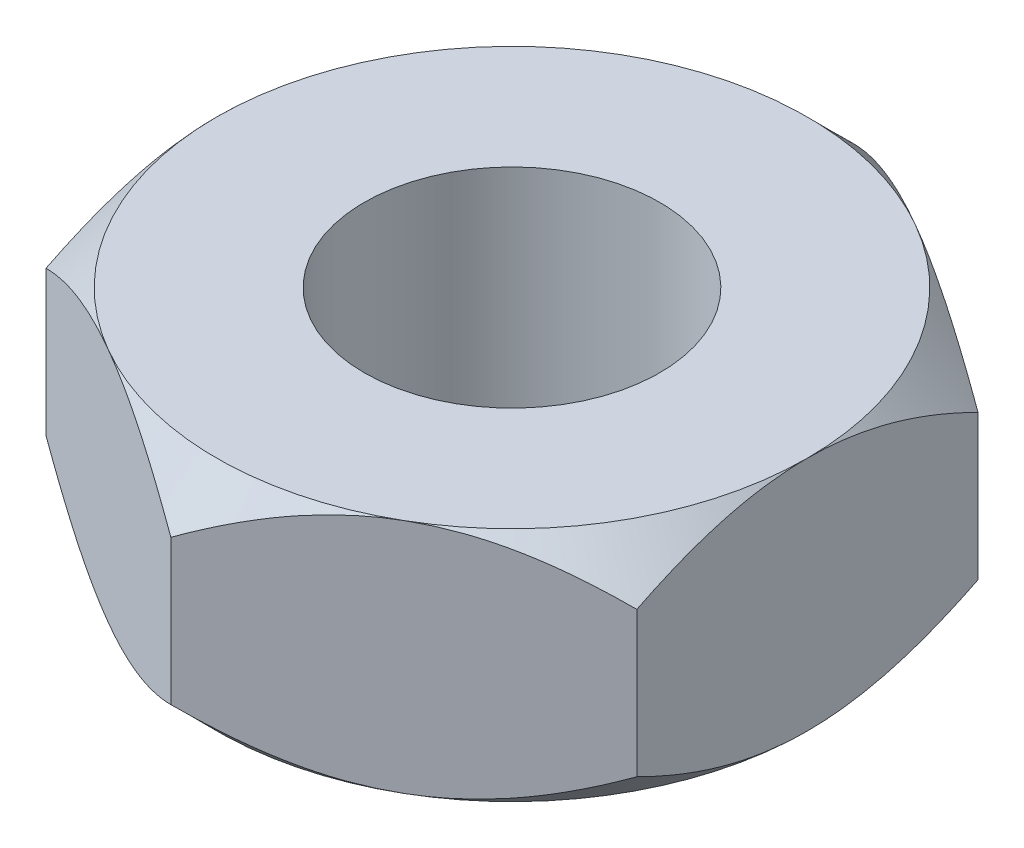
ISO-10303-21;
HEADER;
FILE_DESCRIPTION(('STEP AP214'),'2;1');
FILE_NAME('part.step','',(''),(''),'','','');
FILE_SCHEMA(('AUTOMOTIVE_DESIGN { 1 0 10303 214 1 1 1 1 }'));
ENDSEC;
DATA;
#1=APPLICATION_CONTEXT('core data for automotive mechanical design processes');
#2=APPLICATION_PROTOCOL_DEFINITION('international standard','automotive_design',2000,#1);
#3=PRODUCT_CONTEXT('',#1,'mechanical');
#4=PRODUCT('Part','Part','',(#3));
#5=PRODUCT_RELATED_PRODUCT_CATEGORY('part','',(#4));
#6=PRODUCT_DEFINITION_FORMATION('','',#4);
#7=PRODUCT_DEFINITION_CONTEXT('part definition',#1,'design');
#8=PRODUCT_DEFINITION('design','',#6,#7);
#9=PRODUCT_DEFINITION_SHAPE('','',#8);
#10=(LENGTH_UNIT() NAMED_UNIT(*) SI_UNIT(.MILLI.,.METRE.));
#11=(NAMED_UNIT(*) PLANE_ANGLE_UNIT() SI_UNIT($,.RADIAN.));
#12=(NAMED_UNIT(*) SI_UNIT($,.STERADIAN.) SOLID_ANGLE_UNIT());
#13=UNCERTAINTY_MEASURE_WITH_UNIT(LENGTH_MEASURE(1.E-05),#10,'distance_accuracy_value','');
#14=(GEOMETRIC_REPRESENTATION_CONTEXT(3) GLOBAL_UNCERTAINTY_ASSIGNED_CONTEXT((#13)) GLOBAL_UNIT_ASSIGNED_CONTEXT((#10,
#11,#12)) REPRESENTATION_CONTEXT('',''));
#15=CARTESIAN_POINT('',(0.,0.,0.));
#16=DIRECTION('',(0.,0.,1.));
#17=DIRECTION('',(1.,0.,0.));
#18=AXIS2_PLACEMENT_3D('',#15,#16,#17);
#19=CARTESIAN_POINT('',(1.99999999999999,1.6,-1.15470053837928));
#20=DIRECTION('',(-0.499999999999995,0.,0.866025403784442));
#21=DIRECTION('',(0.866025403784442,0.,0.499999999999995));
#22=AXIS2_PLACEMENT_3D('',#19,#20,#21);
#23=PLANE('',#22);
#24=CARTESIAN_POINT('',(-0.000200000000000004,0.309516555472163,-2.30951654681234));
#25=CARTESIAN_POINT('',(0.0685530340307052,0.269854166984096,-2.26982196410711));
#26=CARTESIAN_POINT('',(0.138455742135511,0.232521059042667,-2.22946361676572));
#27=CARTESIAN_POINT('',(0.280995244550435,0.164164761894649,-2.14716839667631));
#28=CARTESIAN_POINT('',(0.353645597565357,0.133179610495727,-2.10522369580642));
#29=CARTESIAN_POINT('',(0.500141601053969,0.0801012933026502,-2.02064418875707));
#30=CARTESIAN_POINT('',(0.573949935246292,0.057874703935119,-1.97803092714269));
#31=CARTESIAN_POINT('',(0.723191631835261,0.0236298934335896,-1.89186619344274));
#32=CARTESIAN_POINT('',(0.798620433918148,0.0115861059026441,-1.84831735425553));
#33=CARTESIAN_POINT('',(0.928615500671075,0.000719588664081582,-1.77326466747241));
#34=CARTESIAN_POINT('',(0.983013783970105,-0.000889169631519565,-1.74185780396626));
#35=CARTESIAN_POINT('',(1.09172145551969,0.00181995435722156,-1.67909540053413));
#36=CARTESIAN_POINT('',(1.14603080592134,0.00613991451648442,-1.64773988246023));
#37=CARTESIAN_POINT('',(1.25413672758934,0.0204606441684161,-1.58532489948421));
#38=CARTESIAN_POINT('',(1.30793265655479,0.0304677695205167,-1.5542658054147));
#39=CARTESIAN_POINT('',(1.41459426230557,0.0556135070081701,-1.49268469862229));
#40=CARTESIAN_POINT('',(1.46746001007071,0.0707517258007509,-1.46216264491918));
#41=CARTESIAN_POINT('',(1.60287973308984,0.115695580187701,-1.3839780313805));
#42=CARTESIAN_POINT('',(1.68459383484947,0.148889916184325,-1.33680037273299));
#43=CARTESIAN_POINT('',(1.8047470372578,0.204926899929877,-1.26742988897855));
#44=CARTESIAN_POINT('',(1.84434285210917,0.224615779705447,-1.24456923461533));
#45=CARTESIAN_POINT('',(1.92280095888786,0.265788395123377,-1.19927142554654));
#46=CARTESIAN_POINT('',(1.96166368359373,0.287271028409751,-1.17683402097617));
#47=CARTESIAN_POINT('',(2.00019999999999,0.309516555472163,-1.15458506832544));
#48=B_SPLINE_CURVE_WITH_KNOTS('',3,(#24,#25,#26,#27,#28,#29,#30,#31,#32,#33,#34,#35,#36,#37,#38,
#39,#40,#41,#42,#43,#44,#45,#46,#47),.UNSPECIFIED.,.F.,.F.,(4,2,2,2,2,2,2,2,2,2,2,4),(0.,
0.266420613771061,0.534393751523383,0.798110374376907,1.06116288956935,1.24939906803721,
1.43770123566247,1.62621426093931,1.81471283831913,2.11415604834143,2.26347170717788,
2.41269626969768),.UNSPECIFIED.);
#49=CARTESIAN_POINT('',(0.,0.309401076758504,-2.3094010767585));
#50=VERTEX_POINT('',#49);
#51=CARTESIAN_POINT('',(0.99999999999999,0.,-1.73205080756888));
#52=VERTEX_POINT('',#51);
#53=EDGE_CURVE('E51',#50,#52,#48,.T.);
#54=ORIENTED_EDGE('',*,*,#53,.F.);
#55=DIRECTION('',(0.,-1.,0.));
#56=VECTOR('',#55,1.);
#57=CARTESIAN_POINT('',(0.,1.6,-2.3094010767585));
#58=LINE('',#57,#56);
#59=CARTESIAN_POINT('',(0.,1.2905989232415,-2.3094010767585));
#60=VERTEX_POINT('',#59);
#61=EDGE_CURVE('E277',#60,#50,#58,.T.);
#62=ORIENTED_EDGE('',*,*,#61,.F.);
#63=CARTESIAN_POINT('',(2.00019999999999,1.29048344452784,-1.15458506832544));
#64=CARTESIAN_POINT('',(1.93144696596928,1.3301458330159,-1.19427965103067));
#65=CARTESIAN_POINT('',(1.86154425786448,1.36747894095733,-1.23463799837206));
#66=CARTESIAN_POINT('',(1.71900475544955,1.43583523810535,-1.31693321846147));
#67=CARTESIAN_POINT('',(1.64635440243463,1.46682038950427,-1.35887791933136));
#68=CARTESIAN_POINT('',(1.49985839894602,1.51989870669735,-1.44345742638071));
#69=CARTESIAN_POINT('',(1.4260500647537,1.54212529606488,-1.48607068799509));
#70=CARTESIAN_POINT('',(1.27680836816473,1.57637010656641,-1.57223542169504));
#71=CARTESIAN_POINT('',(1.20137956608184,1.58841389409736,-1.61578426088225));
#72=CARTESIAN_POINT('',(1.07138449932891,1.59928041133592,-1.69083694766537));
#73=CARTESIAN_POINT('',(1.01698621602988,1.60088916963152,-1.72224381117152));
#74=CARTESIAN_POINT('',(0.908278544480296,1.59818004564278,-1.78500621460365));
#75=CARTESIAN_POINT('',(0.853969194078651,1.59386008548352,-1.81636173267755));
#76=CARTESIAN_POINT('',(0.745863272410651,1.57953935583158,-1.87877671565357));
#77=CARTESIAN_POINT('',(0.692067343445196,1.56953223047948,-1.90983580972308));
#78=CARTESIAN_POINT('',(0.585405737694414,1.54438649299183,-1.97141691651549));
#79=CARTESIAN_POINT('',(0.532539989929275,1.52924827419925,-2.0019389702186));
#80=CARTESIAN_POINT('',(0.397120266910145,1.4843044198123,-2.08012358375728));
#81=CARTESIAN_POINT('',(0.315406165150513,1.45111008381567,-2.12730124240479));
#82=CARTESIAN_POINT('',(0.195252962742193,1.39507310007012,-2.19667172615923));
#83=CARTESIAN_POINT('',(0.155657147890819,1.37538422029455,-2.21953238052245));
#84=CARTESIAN_POINT('',(0.0771990411121257,1.33421160487662,-2.26483018959124));
#85=CARTESIAN_POINT('',(0.0383363164062586,1.31272897159025,-2.28726759416161));
#86=CARTESIAN_POINT('',(-0.000199999999999872,1.29048344452784,-2.30951654681234));
#87=B_SPLINE_CURVE_WITH_KNOTS('',3,(#63,#64,#65,#66,#67,#68,#69,#70,#71,#72,#73,#74,#75,#76,#77,
#78,#79,#80,#81,#82,#83,#84,#85,#86),.UNSPECIFIED.,.F.,.F.,(4,2,2,2,2,2,2,2,2,2,2,4),(0.,
0.266420613771061,0.534393751523383,0.798110374376907,1.06116288956935,1.24939906803721,
1.43770123566247,1.62621426093931,1.81471283831913,2.11415604834143,2.26347170717788,
2.41269626969768),.UNSPECIFIED.);
#88=CARTESIAN_POINT('',(0.999999999999994,1.6,-1.73205080756889));
#89=VERTEX_POINT('',#88);
#90=EDGE_CURVE('E249',#89,#60,#87,.T.);
#91=ORIENTED_EDGE('',*,*,#90,.F.);
#92=CARTESIAN_POINT('',(1.99999999999999,1.2905989232415,-1.15470053837928));
#93=VERTEX_POINT('',#92);
#94=EDGE_CURVE('E317',#93,#89,#87,.T.);
#95=ORIENTED_EDGE('',*,*,#94,.F.);
#96=DIRECTION('',(0.,-1.,0.));
#97=VECTOR('',#96,1.);
#98=CARTESIAN_POINT('',(1.99999999999999,1.6,-1.15470053837928));
#99=LINE('',#98,#97);
#100=CARTESIAN_POINT('',(1.99999999999999,0.309401076758504,-1.15470053837928));
#101=VERTEX_POINT('',#100);
#102=EDGE_CURVE('E319',#93,#101,#99,.T.);
#103=ORIENTED_EDGE('',*,*,#102,.T.);
#104=EDGE_CURVE('E136',#52,#101,#48,.T.);
#105=ORIENTED_EDGE('',*,*,#104,.F.);
#106=EDGE_LOOP('',(#54,#62,#91,#95,#103,#105));
#107=FACE_BOUND('',#106,.T.);
#108=ADVANCED_FACE('F35',(#107),#23,.F.);
#109=CARTESIAN_POINT('',(0.,1.6,-2.3094010767585));
#110=DIRECTION('',(0.500000000000001,0.,0.866025403784438));
#111=DIRECTION('',(0.866025403784438,0.,-0.500000000000001));
#112=AXIS2_PLACEMENT_3D('',#109,#110,#111);
#113=PLANE('',#112);
#114=CARTESIAN_POINT('',(-2.0002,0.309516555472163,-1.15458506832541));
#115=CARTESIAN_POINT('',(-1.9314469659693,0.269854166984095,-1.19427965103064));
#116=CARTESIAN_POINT('',(-1.86154425786449,0.232521059042665,-1.23463799837204));
#117=CARTESIAN_POINT('',(-1.71900475544957,0.164164761894646,-1.31693321846145));
#118=CARTESIAN_POINT('',(-1.64635440243465,0.133179610495723,-1.35887791933133));
#119=CARTESIAN_POINT('',(-1.49985839894603,0.0801012933026451,-1.44345742638069));
#120=CARTESIAN_POINT('',(-1.42605006475371,0.0578747039351132,-1.48607068799507));
#121=CARTESIAN_POINT('',(-1.27680836816474,0.0236298934335826,-1.57223542169502));
#122=CARTESIAN_POINT('',(-1.20137956608185,0.0115861059026366,-1.61578426088223));
#123=CARTESIAN_POINT('',(-1.07138449932892,0.000719588664073623,-1.69083694766536));
#124=CARTESIAN_POINT('',(-1.01698621602989,-0.000889169631527687,-1.72224381117151));
#125=CARTESIAN_POINT('',(-0.908278544480308,0.00181995435721309,-1.78500621460364));
#126=CARTESIAN_POINT('',(-0.853969194078663,0.00613991451647577,-1.81636173267754));
#127=CARTESIAN_POINT('',(-0.745863272410664,0.0204606441684074,-1.87877671565355));
#128=CARTESIAN_POINT('',(-0.69206734344521,0.0304677695205081,-1.90983580972306));
#129=CARTESIAN_POINT('',(-0.585405737694428,0.0556135070081612,-1.97141691651547));
#130=CARTESIAN_POINT('',(-0.532539989929289,0.0707517258007417,-2.00193897021859));
#131=CARTESIAN_POINT('',(-0.397120266910157,0.115695580187692,-2.08012358375727));
#132=CARTESIAN_POINT('',(-0.315406165150522,0.148889916184318,-2.12730124240478));
#133=CARTESIAN_POINT('',(-0.195252962742198,0.204926899929873,-2.19667172615922));
#134=CARTESIAN_POINT('',(-0.155657147890823,0.224615779705443,-2.21953238052245));
#135=CARTESIAN_POINT('',(-0.0771990411121277,0.265788395123375,-2.26483018959124));
#136=CARTESIAN_POINT('',(-0.0383363164062596,0.28727102840975,-2.28726759416161));
#137=CARTESIAN_POINT('',(0.000200000000000142,0.309516555472163,-2.30951654681234));
#138=B_SPLINE_CURVE_WITH_KNOTS('',3,(#114,#115,#116,#117,#118,#119,#120,#121,#122,#123,#124,
#125,#126,#127,#128,#129,#130,#131,#132,#133,#134,#135,#136,#137),.UNSPECIFIED.,.F.,.F.,(4,2,2,
2,2,2,2,2,2,2,2,4),(0.,0.266420613771064,0.53439375152339,0.798110374376917,1.06116288956937,
1.24939906803722,1.43770123566248,1.62621426093932,1.81471283831914,2.11415604834145,
2.26347170717791,2.41269626969771),.UNSPECIFIED.);
#139=CARTESIAN_POINT('',(-2.,0.309401076758504,-1.15470053837925));
#140=VERTEX_POINT('',#139);
#141=CARTESIAN_POINT('',(-1.,0.,-1.73205080756888));
#142=VERTEX_POINT('',#141);
#143=EDGE_CURVE('E59',#140,#142,#138,.T.);
#144=ORIENTED_EDGE('',*,*,#143,.F.);
#145=DIRECTION('',(0.,-1.,0.));
#146=VECTOR('',#145,1.);
#147=CARTESIAN_POINT('',(-2.,1.6,-1.15470053837925));
#148=LINE('',#147,#146);
#149=CARTESIAN_POINT('',(-2.,1.2905989232415,-1.15470053837925));
#150=VERTEX_POINT('',#149);
#151=EDGE_CURVE('E270',#150,#140,#148,.T.);
#152=ORIENTED_EDGE('',*,*,#151,.F.);
#153=CARTESIAN_POINT('',(0.000200000000000008,1.29048344452784,-2.30951654681234));
#154=CARTESIAN_POINT('',(-0.0685530340307058,1.3301458330159,-2.26982196410711));
#155=CARTESIAN_POINT('',(-0.138455742135512,1.36747894095734,-2.22946361676572));
#156=CARTESIAN_POINT('',(-0.280995244550437,1.43583523810535,-2.1471683966763));
#157=CARTESIAN_POINT('',(-0.353645597565359,1.46682038950428,-2.10522369580642));
#158=CARTESIAN_POINT('',(-0.500141601053973,1.51989870669736,-2.02064418875706));
#159=CARTESIAN_POINT('',(-0.573949935246296,1.54212529606489,-1.97803092714269));
#160=CARTESIAN_POINT('',(-0.723191631835266,1.57637010656642,-1.89186619344273));
#161=CARTESIAN_POINT('',(-0.798620433918154,1.58841389409736,-1.84831735425552));
#162=CARTESIAN_POINT('',(-0.928615500671082,1.59928041133593,-1.7732646674724));
#163=CARTESIAN_POINT('',(-0.983013783970112,1.60088916963153,-1.74185780396625));
#164=CARTESIAN_POINT('',(-1.0917214555197,1.59818004564279,-1.67909540053412));
#165=CARTESIAN_POINT('',(-1.14603080592134,1.59386008548352,-1.64773988246021));
#166=CARTESIAN_POINT('',(-1.25413672758934,1.57953935583159,-1.5853248994842));
#167=CARTESIAN_POINT('',(-1.30793265655479,1.56953223047949,-1.55426580541469));
#168=CARTESIAN_POINT('',(-1.41459426230558,1.54438649299184,-1.49268469862228));
#169=CARTESIAN_POINT('',(-1.46746001007072,1.52924827419926,-1.46216264491916));
#170=CARTESIAN_POINT('',(-1.60287973308985,1.48430441981231,-1.38397803138048));
#171=CARTESIAN_POINT('',(-1.68459383484948,1.45111008381568,-1.33680037273297));
#172=CARTESIAN_POINT('',(-1.80474703725781,1.39507310007013,-1.26742988897853));
#173=CARTESIAN_POINT('',(-1.84434285210918,1.37538422029456,-1.2445692346153));
#174=CARTESIAN_POINT('',(-1.92280095888788,1.33421160487663,-1.19927142554652));
#175=CARTESIAN_POINT('',(-1.96166368359375,1.31272897159025,-1.17683402097614));
#176=CARTESIAN_POINT('',(-2.0002,1.29048344452784,-1.15458506832541));
#177=B_SPLINE_CURVE_WITH_KNOTS('',3,(#153,#154,#155,#156,#157,#158,#159,#160,#161,#162,#163,
#164,#165,#166,#167,#168,#169,#170,#171,#172,#173,#174,#175,#176),.UNSPECIFIED.,.F.,.F.,(4,2,2,
2,2,2,2,2,2,2,2,4),(0.,0.266420613771064,0.534393751523391,0.798110374376917,1.06116288956937,
1.24939906803722,1.43770123566248,1.62621426093932,1.81471283831914,2.11415604834145,
2.26347170717791,2.41269626969771),.UNSPECIFIED.);
#178=CARTESIAN_POINT('',(-1.,1.6,-1.73205080756888));
#179=VERTEX_POINT('',#178);
#180=EDGE_CURVE('E242',#179,#150,#177,.T.);
#181=ORIENTED_EDGE('',*,*,#180,.F.);
#182=EDGE_CURVE('E248',#60,#179,#177,.T.);
#183=ORIENTED_EDGE('',*,*,#182,.F.);
#184=ORIENTED_EDGE('',*,*,#61,.T.);
#185=EDGE_CURVE('E159',#142,#50,#138,.T.);
#186=ORIENTED_EDGE('',*,*,#185,.F.);
#187=EDGE_LOOP('',(#144,#152,#181,#183,#184,#186));
#188=FACE_BOUND('',#187,.T.);
#189=ADVANCED_FACE('F255',(#188),#113,.F.);
#190=CARTESIAN_POINT('',(-2.,1.6,-1.15470053837925));
#191=DIRECTION('',(1.,0.,0.));
#192=DIRECTION('',(0.,0.,-1.));
#193=AXIS2_PLACEMENT_3D('',#190,#191,#192);
#194=PLANE('',#193);
#195=CARTESIAN_POINT('',(-2.00000000000001,1.29019488252983,-2.61254327524453));
#196=CARTESIAN_POINT('',(-2.00000000000001,1.24064534414815,-2.55012778852981));
#197=CARTESIAN_POINT('',(-2.00000000000001,1.19148330047981,-2.48740009058871));
#198=CARTESIAN_POINT('',(-2.00000000000001,1.0941173988925,-2.36118487448526));
#199=CARTESIAN_POINT('',(-2.00000000000001,1.04591374676681,-2.29769719772447));
#200=CARTESIAN_POINT('',(-2.00000000000001,0.950307536984489,-2.16936780427217));
#201=CARTESIAN_POINT('',(-2.00000000000001,0.902913838258009,-2.10451946738864));
#202=CARTESIAN_POINT('',(-2.00000000000001,0.809580787991221,-1.97378837476002));
#203=CARTESIAN_POINT('',(-2.00000000000001,0.763641339653711,-1.90790568830138));
#204=CARTESIAN_POINT('',(-2.00000000000001,0.670147526687691,-1.76987564613341));
#205=CARTESIAN_POINT('',(-2.00000000000001,0.622734688153935,-1.69763195640554));
#206=CARTESIAN_POINT('',(-2.00000000000001,0.530577577337536,-1.55146442665623));
#207=CARTESIAN_POINT('',(-2.00000000000001,0.485832968027409,-1.47754080046576));
#208=CARTESIAN_POINT('',(-2.,0.399917834631021,-1.32791120028739));
#209=CARTESIAN_POINT('',(-2.,0.358737439259264,-1.25221093871324));
#210=CARTESIAN_POINT('',(-2.,0.280881091671754,-1.09854641049698));
#211=CARTESIAN_POINT('',(-2.,0.244202870567784,-1.02058330891973));
#212=CARTESIAN_POINT('',(-2.,0.181029803464532,-0.87223711935323));
#213=CARTESIAN_POINT('',(-2.,0.153832752001086,-0.802156090362227));
#214=CARTESIAN_POINT('',(-2.,0.105040182157819,-0.660033594508962));
#215=CARTESIAN_POINT('',(-2.,0.0834449845291973,-0.587992015650283));
#216=CARTESIAN_POINT('',(-2.,0.0474732392278032,-0.443748253089858));
#217=CARTESIAN_POINT('',(-2.,0.0329510233949112,-0.371583056922965));
#218=CARTESIAN_POINT('',(-2.,0.0114600647392787,-0.226130131551975));
#219=CARTESIAN_POINT('',(-2.,0.00448913863026258,-0.152842733025714));
#220=CARTESIAN_POINT('',(-2.,-0.00116339348483317,-0.0103634777354571));
#221=CARTESIAN_POINT('',(-2.,-0.000318383061124951,0.0588095691835743));
#222=CARTESIAN_POINT('',(-2.,0.00847068441443788,0.196699474123196));
#223=CARTESIAN_POINT('',(-2.,0.0164152870195975,0.265416296677364));
#224=CARTESIAN_POINT('',(-2.,0.0390597197043327,0.403074136856636));
#225=CARTESIAN_POINT('',(-2.,0.0538872817581779,0.471993766190368));
#226=CARTESIAN_POINT('',(-2.,0.0894169378625835,0.608270025322452));
#227=CARTESIAN_POINT('',(-2.,0.110119020964438,0.675626658033603));
#228=CARTESIAN_POINT('',(-2.,0.17976569086058,0.875863394424112));
#229=CARTESIAN_POINT('',(-2.,0.236106709815166,1.00615820059957));
#230=CARTESIAN_POINT('',(-2.,0.361570324526107,1.26069744733846));
#231=CARTESIAN_POINT('',(-2.,0.430736681980139,1.38491927485267));
#232=CARTESIAN_POINT('',(-1.99999999999999,0.538807465716636,1.56449502677459));
#233=CARTESIAN_POINT('',(-1.99999999999999,0.574551900249282,1.62178989348194));
#234=CARTESIAN_POINT('',(-1.99999999999999,0.647583221318526,1.73539571794536));
#235=CARTESIAN_POINT('',(-1.99999999999999,0.684870221444954,1.79170660280819));
#236=CARTESIAN_POINT('',(-1.99999999999999,0.760406855331997,1.9030251252792));
#237=CARTESIAN_POINT('',(-1.99999999999999,0.798646539051194,1.95803954900724));
#238=CARTESIAN_POINT('',(-1.99999999999999,0.87616202513888,2.06731164689541));
#239=CARTESIAN_POINT('',(-1.99999999999999,0.915437539395688,2.12156952519856));
#240=CARTESIAN_POINT('',(-1.99999999999999,0.955138269586996,2.17550963968852));
#241=B_SPLINE_CURVE_WITH_KNOTS('',3,(#195,#196,#197,#198,#199,#200,#201,#202,#203,#204,#205,
#206,#207,#208,#209,#210,#211,#212,#213,#214,#215,#216,#217,#218,#219,#220,#221,#222,#223,#224,
#225,#226,#227,#228,#229,#230,#231,#232,#233,#234,#235,#236,#237,#238,#239,#240),.UNSPECIFIED.,
.F.,.F.,(4,2,2,2,2,2,2,2,2,2,2,2,2,2,2,2,2,2,2,2,2,2,4),(0.,0.239080449310993,0.478211693165812,
0.719158208726349,0.960088652639677,1.21928095842057,1.47844045563563,1.73685755422555,
1.9951438831296,2.22047513680923,2.44581928966948,2.66630243337519,2.88672181228999,
3.09388290836222,3.30105992466437,3.51224559004557,3.72343086182966,4.14807332597343,
4.57419231623005,4.77676462727743,4.97935188177691,5.18033632757739,5.38126544805775),.UNSPECIFIED.);
#242=CARTESIAN_POINT('',(-2.,0.309401076758504,1.15470053837926));
#243=VERTEX_POINT('',#242);
#244=CARTESIAN_POINT('',(-2.,0.,0.));
#245=VERTEX_POINT('',#244);
#246=EDGE_CURVE('E346',#243,#245,#241,.F.);
#247=ORIENTED_EDGE('',*,*,#246,.F.);
#248=DIRECTION('',(0.,-1.,0.));
#249=VECTOR('',#248,1.);
#250=CARTESIAN_POINT('',(-2.,1.6,1.15470053837926));
#251=LINE('',#250,#249);
#252=CARTESIAN_POINT('',(-2.,1.2905989232415,1.15470053837926));
#253=VERTEX_POINT('',#252);
#254=EDGE_CURVE('E278',#253,#243,#251,.T.);
#255=ORIENTED_EDGE('',*,*,#254,.F.);
#256=CARTESIAN_POINT('',(-2.00000000000001,0.309805117470175,-2.61254327524453));
#257=CARTESIAN_POINT('',(-2.00000000000001,0.359354655851849,-2.55012778852981));
#258=CARTESIAN_POINT('',(-2.00000000000001,0.40851669952019,-2.48740009058871));
#259=CARTESIAN_POINT('',(-2.00000000000001,0.5058826011075,-2.36118487448526));
#260=CARTESIAN_POINT('',(-2.00000000000001,0.554086253233187,-2.29769719772447));
#261=CARTESIAN_POINT('',(-2.00000000000001,0.649692463015511,-2.16936780427217));
#262=CARTESIAN_POINT('',(-2.00000000000001,0.697086161741992,-2.10451946738864));
#263=CARTESIAN_POINT('',(-2.00000000000001,0.79041921200878,-1.97378837476002));
#264=CARTESIAN_POINT('',(-2.00000000000001,0.836358660346289,-1.90790568830138));
#265=CARTESIAN_POINT('',(-2.00000000000001,0.929852473312309,-1.76987564613341));
#266=CARTESIAN_POINT('',(-2.00000000000001,0.977265311846065,-1.69763195640554));
#267=CARTESIAN_POINT('',(-2.00000000000001,1.06942242266246,-1.55146442665623));
#268=CARTESIAN_POINT('',(-2.00000000000001,1.11416703197259,-1.47754080046576));
#269=CARTESIAN_POINT('',(-2.,1.20008216536898,-1.32791120028739));
#270=CARTESIAN_POINT('',(-2.,1.24126256074074,-1.25221093871324));
#271=CARTESIAN_POINT('',(-2.,1.31911890832825,-1.09854641049698));
#272=CARTESIAN_POINT('',(-2.,1.35579712943222,-1.02058330891973));
#273=CARTESIAN_POINT('',(-2.,1.41897019653547,-0.87223711935323));
#274=CARTESIAN_POINT('',(-2.,1.44616724799891,-0.802156090362227));
#275=CARTESIAN_POINT('',(-2.,1.49495981784218,-0.660033594508963));
#276=CARTESIAN_POINT('',(-2.,1.5165550154708,-0.587992015650283));
#277=CARTESIAN_POINT('',(-2.,1.5525267607722,-0.443748253089858));
#278=CARTESIAN_POINT('',(-2.,1.56704897660509,-0.371583056922966));
#279=CARTESIAN_POINT('',(-2.,1.58853993526072,-0.226130131551975));
#280=CARTESIAN_POINT('',(-2.,1.59551086136974,-0.152842733025714));
#281=CARTESIAN_POINT('',(-2.,1.60116339348483,-0.0103634777354565));
#282=CARTESIAN_POINT('',(-2.,1.60031838306112,0.0588095691835751));
#283=CARTESIAN_POINT('',(-2.,1.59152931558556,0.196699474123197));
#284=CARTESIAN_POINT('',(-2.,1.5835847129804,0.265416296677365));
#285=CARTESIAN_POINT('',(-2.,1.56094028029567,0.403074136856637));
#286=CARTESIAN_POINT('',(-2.,1.54611271824182,0.471993766190368));
#287=CARTESIAN_POINT('',(-2.,1.51058306213742,0.608270025322452));
#288=CARTESIAN_POINT('',(-2.,1.48988097903556,0.675626658033603));
#289=CARTESIAN_POINT('',(-2.,1.42023430913942,0.875863394424112));
#290=CARTESIAN_POINT('',(-2.,1.36389329018483,1.00615820059957));
#291=CARTESIAN_POINT('',(-2.,1.23842967547389,1.26069744733846));
#292=CARTESIAN_POINT('',(-2.,1.16926331801986,1.38491927485267));
#293=CARTESIAN_POINT('',(-1.99999999999999,1.06119253428336,1.56449502677459));
#294=CARTESIAN_POINT('',(-1.99999999999999,1.02544809975072,1.62178989348194));
#295=CARTESIAN_POINT('',(-1.99999999999999,0.952416778681474,1.73539571794536));
#296=CARTESIAN_POINT('',(-1.99999999999999,0.915129778555046,1.79170660280819));
#297=CARTESIAN_POINT('',(-1.99999999999999,0.839593144668003,1.9030251252792));
#298=CARTESIAN_POINT('',(-1.99999999999999,0.801353460948806,1.95803954900724));
#299=CARTESIAN_POINT('',(-1.99999999999999,0.72383797486112,2.06731164689541));
#300=CARTESIAN_POINT('',(-1.99999999999999,0.684562460604312,2.12156952519857));
#301=CARTESIAN_POINT('',(-1.99999999999999,0.644861730413004,2.17550963968852));
#302=B_SPLINE_CURVE_WITH_KNOTS('',3,(#256,#257,#258,#259,#260,#261,#262,#263,#264,#265,#266,
#267,#268,#269,#270,#271,#272,#273,#274,#275,#276,#277,#278,#279,#280,#281,#282,#283,#284,#285,
#286,#287,#288,#289,#290,#291,#292,#293,#294,#295,#296,#297,#298,#299,#300,#301),.UNSPECIFIED.,
.F.,.F.,(4,2,2,2,2,2,2,2,2,2,2,2,2,2,2,2,2,2,2,2,2,2,4),(0.,0.239080449310993,0.478211693165812,
0.71915820872635,0.960088652639677,1.21928095842057,1.47844045563563,1.73685755422555,
1.9951438831296,2.22047513680923,2.44581928966948,2.66630243337518,2.88672181228999,
3.09388290836222,3.30105992466437,3.51224559004557,3.72343086182966,4.14807332597343,
4.57419231623005,4.77676462727743,4.97935188177691,5.18033632757739,5.38126544805775),.UNSPECIFIED.);
#303=CARTESIAN_POINT('',(-2.,1.6,0.));
#304=VERTEX_POINT('',#303);
#305=EDGE_CURVE('E235',#304,#253,#302,.T.);
#306=ORIENTED_EDGE('',*,*,#305,.F.);
#307=EDGE_CURVE('E241',#150,#304,#302,.T.);
#308=ORIENTED_EDGE('',*,*,#307,.F.);
#309=ORIENTED_EDGE('',*,*,#151,.T.);
#310=EDGE_CURVE('E194',#245,#140,#241,.F.);
#311=ORIENTED_EDGE('',*,*,#310,.F.);
#312=EDGE_LOOP('',(#247,#255,#306,#308,#309,#311));
#313=FACE_BOUND('',#312,.T.);
#314=ADVANCED_FACE('F216',(#313),#194,.F.);
#315=CARTESIAN_POINT('',(-2.,1.6,1.15470053837926));
#316=DIRECTION('',(0.499999999999995,0.,-0.866025403784442));
#317=DIRECTION('',(-0.866025403784442,0.,-0.499999999999995));
#318=AXIS2_PLACEMENT_3D('',#315,#316,#317);
#319=PLANE('',#318);
#320=CARTESIAN_POINT('',(0.000200000000016131,0.309516555472163,2.30951654681234));
#321=CARTESIAN_POINT('',(-0.0685530340306898,0.269854166984095,2.26982196410711));
#322=CARTESIAN_POINT('',(-0.138455742135496,0.232521059042665,2.22946361676572));
#323=CARTESIAN_POINT('',(-0.280995244550422,0.164164761894646,2.14716839667631));
#324=CARTESIAN_POINT('',(-0.353645597565344,0.133179610495723,2.10522369580642));
#325=CARTESIAN_POINT('',(-0.500141601053958,0.0801012933026448,2.02064418875707));
#326=CARTESIAN_POINT('',(-0.573949935246282,0.0578747039351128,1.97803092714269));
#327=CARTESIAN_POINT('',(-0.723191631835253,0.0236298934335822,1.89186619344273));
#328=CARTESIAN_POINT('',(-0.798620433918141,0.0115861059026363,1.84831735425553));
#329=CARTESIAN_POINT('',(-0.928615500671069,0.00071958866407349,1.7732646674724));
#330=CARTESIAN_POINT('',(-0.983013783970099,-0.000889169631527772,1.74185780396625));
#331=CARTESIAN_POINT('',(-1.09172145551968,0.00181995435721307,1.67909540053412));
#332=CARTESIAN_POINT('',(-1.14603080592133,0.00613991451647579,1.64773988246022));
#333=CARTESIAN_POINT('',(-1.25413672758933,0.0204606441684073,1.58532489948421));
#334=CARTESIAN_POINT('',(-1.30793265655478,0.030467769520508,1.5542658054147));
#335=CARTESIAN_POINT('',(-1.41459426230556,0.0556135070081611,1.49268469862229));
#336=CARTESIAN_POINT('',(-1.4674600100707,0.0707517258007416,1.46216264491917));
#337=CARTESIAN_POINT('',(-1.60287973308984,0.115695580187693,1.3839780313805));
#338=CARTESIAN_POINT('',(-1.68459383484947,0.148889916184318,1.33680037273298));
#339=CARTESIAN_POINT('',(-1.8047470372578,0.204926899929872,1.26742988897854));
#340=CARTESIAN_POINT('',(-1.84434285210917,0.224615779705442,1.24456923461532));
#341=CARTESIAN_POINT('',(-1.92280095888787,0.265788395123374,1.19927142554653));
#342=CARTESIAN_POINT('',(-1.96166368359374,0.28727102840975,1.17683402097615));
#343=CARTESIAN_POINT('',(-2.0002,0.309516555472163,1.15458506832542));
#344=B_SPLINE_CURVE_WITH_KNOTS('',3,(#320,#321,#322,#323,#324,#325,#326,#327,#328,#329,#330,
#331,#332,#333,#334,#335,#336,#337,#338,#339,#340,#341,#342,#343),.UNSPECIFIED.,.F.,.F.,(4,2,2,
2,2,2,2,2,2,2,2,4),(0.,0.266420613771064,0.53439375152339,0.798110374376917,1.06116288956937,
1.24939906803722,1.43770123566248,1.62621426093932,1.81471283831914,2.11415604834145,
2.26347170717791,2.41269626969771),.UNSPECIFIED.);
#345=CARTESIAN_POINT('',(0.,0.309401076758504,2.3094010767585));
#346=VERTEX_POINT('',#345);
#347=CARTESIAN_POINT('',(-0.99999999999999,0.,1.73205080756888));
#348=VERTEX_POINT('',#347);
#349=EDGE_CURVE('E145',#346,#348,#344,.T.);
#350=ORIENTED_EDGE('',*,*,#349,.F.);
#351=DIRECTION('',(0.,-1.,0.));
#352=VECTOR('',#351,1.);
#353=CARTESIAN_POINT('',(0.,1.6,2.3094010767585));
#354=LINE('',#353,#352);
#355=CARTESIAN_POINT('',(0.,1.2905989232415,2.3094010767585));
#356=VERTEX_POINT('',#355);
#357=EDGE_CURVE('E158',#356,#346,#354,.T.);
#358=ORIENTED_EDGE('',*,*,#357,.F.);
#359=CARTESIAN_POINT('',(-2.0002,1.29048344452784,1.15458506832542));
#360=CARTESIAN_POINT('',(-1.93144696596929,1.33014583301591,1.19427965103065));
#361=CARTESIAN_POINT('',(-1.86154425786448,1.36747894095734,1.23463799837205));
#362=CARTESIAN_POINT('',(-1.71900475544956,1.43583523810535,1.31693321846146));
#363=CARTESIAN_POINT('',(-1.64635440243464,1.46682038950428,1.35887791933135));
#364=CARTESIAN_POINT('',(-1.49985839894602,1.51989870669736,1.4434574263807));
#365=CARTESIAN_POINT('',(-1.4260500647537,1.54212529606489,1.48607068799508));
#366=CARTESIAN_POINT('',(-1.27680836816473,1.57637010656642,1.57223542169503));
#367=CARTESIAN_POINT('',(-1.20137956608184,1.58841389409736,1.61578426088224));
#368=CARTESIAN_POINT('',(-1.07138449932891,1.59928041133593,1.69083694766536));
#369=CARTESIAN_POINT('',(-1.01698621602988,1.60088916963153,1.72224381117151));
#370=CARTESIAN_POINT('',(-0.908278544480297,1.59818004564279,1.78500621460364));
#371=CARTESIAN_POINT('',(-0.853969194078652,1.59386008548352,1.81636173267754));
#372=CARTESIAN_POINT('',(-0.745863272410653,1.57953935583159,1.87877671565356));
#373=CARTESIAN_POINT('',(-0.692067343445198,1.56953223047949,1.90983580972307));
#374=CARTESIAN_POINT('',(-0.585405737694417,1.54438649299184,1.97141691651548));
#375=CARTESIAN_POINT('',(-0.532539989929277,1.52924827419926,2.00193897021859));
#376=CARTESIAN_POINT('',(-0.397120266910144,1.48430441981231,2.08012358375727));
#377=CARTESIAN_POINT('',(-0.315406165150509,1.45111008381568,2.12730124240478));
#378=CARTESIAN_POINT('',(-0.195252962742184,1.39507310007013,2.19667172615923));
#379=CARTESIAN_POINT('',(-0.155657147890808,1.37538422029456,2.21953238052245));
#380=CARTESIAN_POINT('',(-0.0771990411121122,1.33421160487663,2.26483018959124));
#381=CARTESIAN_POINT('',(-0.0383363164062437,1.31272897159025,2.28726759416161));
#382=CARTESIAN_POINT('',(0.000200000000016104,1.29048344452784,2.30951654681234));
#383=B_SPLINE_CURVE_WITH_KNOTS('',3,(#359,#360,#361,#362,#363,#364,#365,#366,#367,#368,#369,
#370,#371,#372,#373,#374,#375,#376,#377,#378,#379,#380,#381,#382),.UNSPECIFIED.,.F.,.F.,(4,2,2,
2,2,2,2,2,2,2,2,4),(0.,0.266420613771064,0.53439375152339,0.798110374376916,1.06116288956937,
1.24939906803722,1.43770123566248,1.62621426093932,1.81471283831913,2.11415604834145,
2.26347170717791,2.41269626969771),.UNSPECIFIED.);
#384=CARTESIAN_POINT('',(-0.99999999999999,1.6,1.73205080756888));
#385=VERTEX_POINT('',#384);
#386=EDGE_CURVE('E221',#385,#356,#383,.T.);
#387=ORIENTED_EDGE('',*,*,#386,.F.);
#388=EDGE_CURVE('E228',#253,#385,#383,.T.);
#389=ORIENTED_EDGE('',*,*,#388,.F.);
#390=ORIENTED_EDGE('',*,*,#254,.T.);
#391=EDGE_CURVE('E161',#348,#243,#344,.T.);
#392=ORIENTED_EDGE('',*,*,#391,.F.);
#393=EDGE_LOOP('',(#350,#358,#387,#389,#390,#392));
#394=FACE_BOUND('',#393,.T.);
#395=ADVANCED_FACE('F213',(#394),#319,.F.);
#396=CARTESIAN_POINT('',(0.,1.6,2.3094010767585));
#397=DIRECTION('',(-0.500000000000007,0.,-0.866025403784435));
#398=DIRECTION('',(-0.866025403784435,0.,0.500000000000007));
#399=AXIS2_PLACEMENT_3D('',#396,#397,#398);
#400=PLANE('',#399);
#401=CARTESIAN_POINT('',(2.00020000000001,0.309516555472163,1.1545850683254));
#402=CARTESIAN_POINT('',(1.93144696596931,0.269854166984095,1.19427965103063));
#403=CARTESIAN_POINT('',(1.8615442578645,0.232521059042665,1.23463799837202));
#404=CARTESIAN_POINT('',(1.71900475544958,0.164164761894645,1.31693321846144));
#405=CARTESIAN_POINT('',(1.64635440243465,0.133179610495723,1.35887791933132));
#406=CARTESIAN_POINT('',(1.49985839894604,0.0801012933026446,1.44345742638068));
#407=CARTESIAN_POINT('',(1.42605006475372,0.0578747039351128,1.48607068799506));
#408=CARTESIAN_POINT('',(1.27680836816475,0.0236298934335822,1.57223542169502));
#409=CARTESIAN_POINT('',(1.20137956608186,0.0115861059026362,1.61578426088222));
#410=CARTESIAN_POINT('',(1.07138449932893,0.000719588664073491,1.69083694766535));
#411=CARTESIAN_POINT('',(1.0169862160299,-0.000889169631527705,1.7222438111715));
#412=CARTESIAN_POINT('',(0.90827854448032,0.00181995435721332,1.78500621460363));
#413=CARTESIAN_POINT('',(0.853969194078675,0.00613991451647613,1.81636173267753));
#414=CARTESIAN_POINT('',(0.745863272410677,0.0204606441684078,1.87877671565355));
#415=CARTESIAN_POINT('',(0.692067343445223,0.0304677695205085,1.90983580972306));
#416=CARTESIAN_POINT('',(0.585405737694442,0.0556135070081616,1.97141691651547));
#417=CARTESIAN_POINT('',(0.532539989929303,0.0707517258007421,2.00193897021858));
#418=CARTESIAN_POINT('',(0.397120266910171,0.115695580187693,2.08012358375727));
#419=CARTESIAN_POINT('',(0.315406165150537,0.148889916184319,2.12730124240478));
#420=CARTESIAN_POINT('',(0.195252962742213,0.204926899929873,2.19667172615922));
#421=CARTESIAN_POINT('',(0.155657147890839,0.224615779705443,2.21953238052245));
#422=CARTESIAN_POINT('',(0.0771990411121436,0.265788395123375,2.26483018959124));
#423=CARTESIAN_POINT('',(0.0383363164062756,0.28727102840975,2.28726759416161));
#424=CARTESIAN_POINT('',(-0.000199999999983961,0.309516555472163,2.30951654681234));
#425=B_SPLINE_CURVE_WITH_KNOTS('',3,(#401,#402,#403,#404,#405,#406,#407,#408,#409,#410,#411,
#412,#413,#414,#415,#416,#417,#418,#419,#420,#421,#422,#423,#424),.UNSPECIFIED.,.F.,.F.,(4,2,2,
2,2,2,2,2,2,2,2,4),(0.,0.266420613771065,0.534393751523391,0.798110374376918,1.06116288956937,
1.24939906803722,1.43770123566248,1.62621426093932,1.81471283831914,2.11415604834145,
2.26347170717791,2.41269626969771),.UNSPECIFIED.);
#426=CARTESIAN_POINT('',(2.00000000000001,0.309401076758504,1.15470053837923));
#427=VERTEX_POINT('',#426);
#428=CARTESIAN_POINT('',(1.00000000000001,0.,1.73205080756887));
#429=VERTEX_POINT('',#428);
#430=EDGE_CURVE('E125',#427,#429,#425,.T.);
#431=ORIENTED_EDGE('',*,*,#430,.F.);
#432=DIRECTION('',(0.,-1.,0.));
#433=VECTOR('',#432,1.);
#434=CARTESIAN_POINT('',(2.00000000000001,1.6,1.15470053837923));
#435=LINE('',#434,#433);
#436=CARTESIAN_POINT('',(2.00000000000001,1.2905989232415,1.15470053837923));
#437=VERTEX_POINT('',#436);
#438=EDGE_CURVE('E324',#437,#427,#435,.T.);
#439=ORIENTED_EDGE('',*,*,#438,.F.);
#440=CARTESIAN_POINT('',(-0.00019999999998388,1.29048344452784,2.30951654681234));
#441=CARTESIAN_POINT('',(0.0685530340307216,1.3301458330159,2.26982196410711));
#442=CARTESIAN_POINT('',(0.138455742135528,1.36747894095734,2.22946361676572));
#443=CARTESIAN_POINT('',(0.280995244550452,1.43583523810535,2.1471683966763));
#444=CARTESIAN_POINT('',(0.353645597565374,1.46682038950428,2.10522369580642));
#445=CARTESIAN_POINT('',(0.500141601053987,1.51989870669736,2.02064418875706));
#446=CARTESIAN_POINT('',(0.57394993524631,1.54212529606489,1.97803092714268));
#447=CARTESIAN_POINT('',(0.723191631835279,1.57637010656642,1.89186619344272));
#448=CARTESIAN_POINT('',(0.798620433918167,1.58841389409736,1.84831735425552));
#449=CARTESIAN_POINT('',(0.928615500671094,1.59928041133593,1.77326466747239));
#450=CARTESIAN_POINT('',(0.983013783970123,1.60088916963153,1.74185780396624));
#451=CARTESIAN_POINT('',(1.09172145551971,1.59818004564279,1.67909540053411));
#452=CARTESIAN_POINT('',(1.14603080592135,1.59386008548352,1.6477398824602));
#453=CARTESIAN_POINT('',(1.25413672758935,1.57953935583159,1.58532489948419));
#454=CARTESIAN_POINT('',(1.30793265655481,1.56953223047949,1.55426580541468));
#455=CARTESIAN_POINT('',(1.41459426230559,1.54438649299184,1.49268469862227));
#456=CARTESIAN_POINT('',(1.46746001007073,1.52924827419926,1.46216264491915));
#457=CARTESIAN_POINT('',(1.60287973308986,1.48430441981231,1.38397803138047));
#458=CARTESIAN_POINT('',(1.68459383484949,1.45111008381568,1.33680037273296));
#459=CARTESIAN_POINT('',(1.80474703725781,1.39507310007013,1.26742988897852));
#460=CARTESIAN_POINT('',(1.84434285210919,1.37538422029456,1.24456923461529));
#461=CARTESIAN_POINT('',(1.92280095888788,1.33421160487663,1.1992714255465));
#462=CARTESIAN_POINT('',(1.96166368359375,1.31272897159025,1.17683402097613));
#463=CARTESIAN_POINT('',(2.00020000000001,1.29048344452784,1.1545850683254));
#464=B_SPLINE_CURVE_WITH_KNOTS('',3,(#440,#441,#442,#443,#444,#445,#446,#447,#448,#449,#450,
#451,#452,#453,#454,#455,#456,#457,#458,#459,#460,#461,#462,#463),.UNSPECIFIED.,.F.,.F.,(4,2,2,
2,2,2,2,2,2,2,2,4),(0.,0.266420613771065,0.534393751523391,0.798110374376917,1.06116288956937,
1.24939906803722,1.43770123566248,1.62621426093932,1.81471283831914,2.11415604834145,
2.26347170717791,2.41269626969771),.UNSPECIFIED.);
#465=CARTESIAN_POINT('',(1.00000000000001,1.6,1.73205080756887));
#466=VERTEX_POINT('',#465);
#467=EDGE_CURVE('E230',#466,#437,#464,.T.);
#468=ORIENTED_EDGE('',*,*,#467,.F.);
#469=EDGE_CURVE('E229',#356,#466,#464,.T.);
#470=ORIENTED_EDGE('',*,*,#469,.F.);
#471=ORIENTED_EDGE('',*,*,#357,.T.);
#472=EDGE_CURVE('E139',#429,#346,#425,.T.);
#473=ORIENTED_EDGE('',*,*,#472,.F.);
#474=EDGE_LOOP('',(#431,#439,#468,#470,#471,#473));
#475=FACE_BOUND('',#474,.T.);
#476=ADVANCED_FACE('F155',(#475),#400,.F.);
#477=CARTESIAN_POINT('',(2.00000000000001,1.6,1.15470053837923));
#478=DIRECTION('',(-1.,0.,0.));
#479=DIRECTION('',(0.,0.,1.));
#480=AXIS2_PLACEMENT_3D('',#477,#478,#479);
#481=PLANE('',#480);
#482=CARTESIAN_POINT('',(1.99999999999997,1.29019488252983,-2.61254327524456));
#483=CARTESIAN_POINT('',(1.99999999999997,1.24064534414815,-2.55012778852984));
#484=CARTESIAN_POINT('',(1.99999999999997,1.19148330047981,-2.48740009058874));
#485=CARTESIAN_POINT('',(1.99999999999998,1.0941173988925,-2.36118487448529));
#486=CARTESIAN_POINT('',(1.99999999999998,1.04591374676681,-2.2976971977245));
#487=CARTESIAN_POINT('',(1.99999999999998,0.95030753698449,-2.1693678042722));
#488=CARTESIAN_POINT('',(1.99999999999998,0.902913838258009,-2.10451946738867));
#489=CARTESIAN_POINT('',(1.99999999999998,0.80958078799122,-1.97378837476004));
#490=CARTESIAN_POINT('',(1.99999999999998,0.763641339653711,-1.90790568830141));
#491=CARTESIAN_POINT('',(1.99999999999998,0.670147526687691,-1.76987564613344));
#492=CARTESIAN_POINT('',(1.99999999999998,0.622734688153935,-1.69763195640557));
#493=CARTESIAN_POINT('',(1.99999999999998,0.530577577337536,-1.55146442665626));
#494=CARTESIAN_POINT('',(1.99999999999998,0.48583296802741,-1.47754080046579));
#495=CARTESIAN_POINT('',(1.99999999999999,0.399917834631021,-1.32791120028741));
#496=CARTESIAN_POINT('',(1.99999999999999,0.358737439259264,-1.25221093871327));
#497=CARTESIAN_POINT('',(1.99999999999999,0.280881091671754,-1.09854641049701));
#498=CARTESIAN_POINT('',(1.99999999999999,0.244202870567784,-1.02058330891976));
#499=CARTESIAN_POINT('',(1.99999999999999,0.181029803464532,-0.872237119353258));
#500=CARTESIAN_POINT('',(1.99999999999999,0.153832752001086,-0.802156090362255));
#501=CARTESIAN_POINT('',(1.99999999999999,0.105040182157819,-0.660033594508991));
#502=CARTESIAN_POINT('',(1.99999999999999,0.0834449845291972,-0.587992015650311));
#503=CARTESIAN_POINT('',(2.,0.0474732392278029,-0.443748253089886));
#504=CARTESIAN_POINT('',(2.,0.0329510233949108,-0.371583056922994));
#505=CARTESIAN_POINT('',(2.,0.0114600647392786,-0.226130131552003));
#506=CARTESIAN_POINT('',(2.,0.00448913863026275,-0.152842733025742));
#507=CARTESIAN_POINT('',(2.,-0.00116339348483295,-0.0103634777354849));
#508=CARTESIAN_POINT('',(2.,-0.00031838306112494,0.0588095691835465));
#509=CARTESIAN_POINT('',(2.,0.00847068441443795,0.196699474123168));
#510=CARTESIAN_POINT('',(2.,0.0164152870195978,0.265416296677336));
#511=CARTESIAN_POINT('',(2.,0.039059719704333,0.403074136856608));
#512=CARTESIAN_POINT('',(2.,0.0538872817581778,0.47199376619034));
#513=CARTESIAN_POINT('',(2.00000000000001,0.0894169378625831,0.608270025322423));
#514=CARTESIAN_POINT('',(2.00000000000001,0.110119020964438,0.675626658033574));
#515=CARTESIAN_POINT('',(2.00000000000001,0.17976569086058,0.875863394424083));
#516=CARTESIAN_POINT('',(2.00000000000001,0.236106709815165,1.00615820059954));
#517=CARTESIAN_POINT('',(2.00000000000001,0.361570324526106,1.26069744733843));
#518=CARTESIAN_POINT('',(2.00000000000001,0.430736681980138,1.38491927485264));
#519=CARTESIAN_POINT('',(2.00000000000002,0.538807465716635,1.56449502677456));
#520=CARTESIAN_POINT('',(2.00000000000002,0.574551900249281,1.62178989348191));
#521=CARTESIAN_POINT('',(2.00000000000002,0.647583221318525,1.73539571794533));
#522=CARTESIAN_POINT('',(2.00000000000002,0.684870221444953,1.79170660280816));
#523=CARTESIAN_POINT('',(2.00000000000002,0.760406855331996,1.90302512527917));
#524=CARTESIAN_POINT('',(2.00000000000002,0.798646539051193,1.95803954900721));
#525=CARTESIAN_POINT('',(2.00000000000002,0.876162025138879,2.06731164689538));
#526=CARTESIAN_POINT('',(2.00000000000002,0.915437539395686,2.12156952519854));
#527=CARTESIAN_POINT('',(2.00000000000002,0.955138269586995,2.17550963968849));
#528=B_SPLINE_CURVE_WITH_KNOTS('',3,(#482,#483,#484,#485,#486,#487,#488,#489,#490,#491,#492,
#493,#494,#495,#496,#497,#498,#499,#500,#501,#502,#503,#504,#505,#506,#507,#508,#509,#510,#511,
#512,#513,#514,#515,#516,#517,#518,#519,#520,#521,#522,#523,#524,#525,#526,#527),.UNSPECIFIED.,
.F.,.F.,(4,2,2,2,2,2,2,2,2,2,2,2,2,2,2,2,2,2,2,2,2,2,4),(0.,0.239080449310993,0.478211693165813,
0.71915820872635,0.960088652639678,1.21928095842057,1.47844045563563,1.73685755422555,
1.9951438831296,2.22047513680923,2.44581928966948,2.66630243337519,2.88672181228999,
3.09388290836222,3.30105992466437,3.51224559004557,3.72343086182966,4.14807332597343,
4.57419231623005,4.77676462727743,4.97935188177691,5.18033632757739,5.38126544805775),.UNSPECIFIED.);
#529=CARTESIAN_POINT('',(2.,0.,0.));
#530=VERTEX_POINT('',#529);
#531=EDGE_CURVE('E137',#101,#530,#528,.T.);
#532=ORIENTED_EDGE('',*,*,#531,.F.);
#533=ORIENTED_EDGE('',*,*,#102,.F.);
#534=CARTESIAN_POINT('',(1.99999999999997,0.309805117470175,-2.61254327524456));
#535=CARTESIAN_POINT('',(1.99999999999997,0.359354655851849,-2.55012778852984));
#536=CARTESIAN_POINT('',(1.99999999999997,0.40851669952019,-2.48740009058874));
#537=CARTESIAN_POINT('',(1.99999999999998,0.5058826011075,-2.36118487448528));
#538=CARTESIAN_POINT('',(1.99999999999998,0.554086253233187,-2.2976971977245));
#539=CARTESIAN_POINT('',(1.99999999999998,0.649692463015511,-2.1693678042722));
#540=CARTESIAN_POINT('',(1.99999999999998,0.697086161741991,-2.10451946738867));
#541=CARTESIAN_POINT('',(1.99999999999998,0.79041921200878,-1.97378837476004));
#542=CARTESIAN_POINT('',(1.99999999999998,0.83635866034629,-1.90790568830141));
#543=CARTESIAN_POINT('',(1.99999999999998,0.92985247331231,-1.76987564613344));
#544=CARTESIAN_POINT('',(1.99999999999998,0.977265311846066,-1.69763195640557));
#545=CARTESIAN_POINT('',(1.99999999999998,1.06942242266246,-1.55146442665626));
#546=CARTESIAN_POINT('',(1.99999999999998,1.11416703197259,-1.47754080046579));
#547=CARTESIAN_POINT('',(1.99999999999999,1.20008216536898,-1.32791120028741));
#548=CARTESIAN_POINT('',(1.99999999999999,1.24126256074074,-1.25221093871327));
#549=CARTESIAN_POINT('',(1.99999999999999,1.31911890832825,-1.09854641049701));
#550=CARTESIAN_POINT('',(1.99999999999999,1.35579712943222,-1.02058330891976));
#551=CARTESIAN_POINT('',(1.99999999999999,1.41897019653547,-0.872237119353257));
#552=CARTESIAN_POINT('',(1.99999999999999,1.44616724799891,-0.802156090362255));
#553=CARTESIAN_POINT('',(1.99999999999999,1.49495981784218,-0.66003359450899));
#554=CARTESIAN_POINT('',(1.99999999999999,1.5165550154708,-0.587992015650311));
#555=CARTESIAN_POINT('',(2.,1.5525267607722,-0.443748253089886));
#556=CARTESIAN_POINT('',(2.,1.56704897660509,-0.371583056922993));
#557=CARTESIAN_POINT('',(2.,1.58853993526072,-0.226130131552003));
#558=CARTESIAN_POINT('',(2.,1.59551086136974,-0.152842733025742));
#559=CARTESIAN_POINT('',(2.,1.60116339348483,-0.0103634777354849));
#560=CARTESIAN_POINT('',(2.,1.60031838306112,0.0588095691835465));
#561=CARTESIAN_POINT('',(2.,1.59152931558556,0.196699474123168));
#562=CARTESIAN_POINT('',(2.,1.5835847129804,0.265416296677336));
#563=CARTESIAN_POINT('',(2.,1.56094028029567,0.403074136856608));
#564=CARTESIAN_POINT('',(2.,1.54611271824182,0.47199376619034));
#565=CARTESIAN_POINT('',(2.00000000000001,1.51058306213742,0.608270025322423));
#566=CARTESIAN_POINT('',(2.00000000000001,1.48988097903556,0.675626658033574));
#567=CARTESIAN_POINT('',(2.00000000000001,1.42023430913942,0.875863394424083));
#568=CARTESIAN_POINT('',(2.00000000000001,1.36389329018483,1.00615820059954));
#569=CARTESIAN_POINT('',(2.00000000000001,1.23842967547389,1.26069744733843));
#570=CARTESIAN_POINT('',(2.00000000000001,1.16926331801986,1.38491927485264));
#571=CARTESIAN_POINT('',(2.00000000000002,1.06119253428337,1.56449502677456));
#572=CARTESIAN_POINT('',(2.00000000000002,1.02544809975072,1.62178989348191));
#573=CARTESIAN_POINT('',(2.00000000000002,0.952416778681475,1.73539571794533));
#574=CARTESIAN_POINT('',(2.00000000000002,0.915129778555047,1.79170660280816));
#575=CARTESIAN_POINT('',(2.00000000000002,0.839593144668004,1.90302512527917));
#576=CARTESIAN_POINT('',(2.00000000000002,0.801353460948807,1.95803954900721));
#577=CARTESIAN_POINT('',(2.00000000000002,0.723837974861121,2.06731164689538));
#578=CARTESIAN_POINT('',(2.00000000000002,0.684562460604314,2.12156952519854));
#579=CARTESIAN_POINT('',(2.00000000000002,0.644861730413005,2.17550963968849));
#580=B_SPLINE_CURVE_WITH_KNOTS('',3,(#534,#535,#536,#537,#538,#539,#540,#541,#542,#543,#544,
#545,#546,#547,#548,#549,#550,#551,#552,#553,#554,#555,#556,#557,#558,#559,#560,#561,#562,#563,
#564,#565,#566,#567,#568,#569,#570,#571,#572,#573,#574,#575,#576,#577,#578,#579),.UNSPECIFIED.,
.F.,.F.,(4,2,2,2,2,2,2,2,2,2,2,2,2,2,2,2,2,2,2,2,2,2,4),(0.,0.239080449310993,0.478211693165813,
0.719158208726351,0.960088652639679,1.21928095842057,1.47844045563563,1.73685755422555,
1.9951438831296,2.22047513680923,2.44581928966948,2.66630243337519,2.88672181228999,
3.09388290836222,3.30105992466437,3.51224559004557,3.72343086182966,4.14807332597343,
4.57419231623005,4.77676462727743,4.97935188177691,5.18033632757739,5.38126544805775),.UNSPECIFIED.);
#581=CARTESIAN_POINT('',(2.,1.6,0.));
#582=VERTEX_POINT('',#581);
#583=EDGE_CURVE('E280',#582,#93,#580,.F.);
#584=ORIENTED_EDGE('',*,*,#583,.F.);
#585=EDGE_CURVE('E150',#437,#582,#580,.F.);
#586=ORIENTED_EDGE('',*,*,#585,.F.);
#587=ORIENTED_EDGE('',*,*,#438,.T.);
#588=EDGE_CURVE('E131',#530,#427,#528,.T.);
#589=ORIENTED_EDGE('',*,*,#588,.F.);
#590=EDGE_LOOP('',(#532,#533,#584,#586,#587,#589));
#591=FACE_BOUND('',#590,.T.);
#592=ADVANCED_FACE('F289',(#591),#481,.F.);
#593=CARTESIAN_POINT('',(0.,0.,0.));
#594=DIRECTION('',(0.,1.,0.));
#595=DIRECTION('',(0.,0.,1.));
#596=AXIS2_PLACEMENT_3D('',#593,#594,#595);
#597=PLANE('',#596);
#598=CARTESIAN_POINT('',(0.,0.,0.));
#599=DIRECTION('',(0.,1.,0.));
#600=DIRECTION('',(0.,0.,1.));
#601=AXIS2_PLACEMENT_3D('',#598,#599,#600);
#602=CIRCLE('',#601,1.);
#603=CARTESIAN_POINT('',(0.,0.,1.));
#604=VERTEX_POINT('',#603);
#605=EDGE_CURVE('E316',#604,#604,#602,.T.);
#606=ORIENTED_EDGE('',*,*,#605,.T.);
#607=EDGE_LOOP('',(#606));
#608=FACE_BOUND('',#607,.T.);
#609=CARTESIAN_POINT('',(0.,0.,0.));
#610=DIRECTION('',(0.,1.,0.));
#611=DIRECTION('',(0.,0.,1.));
#612=AXIS2_PLACEMENT_3D('',#609,#610,#611);
#613=CIRCLE('',#612,2.);
#614=EDGE_CURVE('E12',#429,#530,#613,.T.);
#615=ORIENTED_EDGE('',*,*,#614,.F.);
#616=EDGE_CURVE('E39',#348,#429,#613,.T.);
#617=ORIENTED_EDGE('',*,*,#616,.F.);
#618=EDGE_CURVE('E149',#245,#348,#613,.T.);
#619=ORIENTED_EDGE('',*,*,#618,.F.);
#620=EDGE_CURVE('E493',#142,#245,#613,.T.);
#621=ORIENTED_EDGE('',*,*,#620,.F.);
#622=EDGE_CURVE('E44',#52,#142,#613,.T.);
#623=ORIENTED_EDGE('',*,*,#622,.F.);
#624=CARTESIAN_POINT('',(0.,0.,0.));
#625=DIRECTION('',(0.,-1.,0.));
#626=DIRECTION('',(0.,0.,-1.));
#627=AXIS2_PLACEMENT_3D('',#624,#625,#626);
#628=CIRCLE('',#627,2.);
#629=EDGE_CURVE('E153',#52,#530,#628,.T.);
#630=ORIENTED_EDGE('',*,*,#629,.T.);
#631=EDGE_LOOP('',(#615,#617,#619,#621,#623,#630));
#632=FACE_BOUND('',#631,.T.);
#633=ADVANCED_FACE('F151',(#608,#632),#597,.F.);
#634=CARTESIAN_POINT('',(0.,1.6,0.));
#635=DIRECTION('',(0.,1.,0.));
#636=DIRECTION('',(0.,0.,1.));
#637=AXIS2_PLACEMENT_3D('',#634,#635,#636);
#638=PLANE('',#637);
#639=CARTESIAN_POINT('',(0.,1.6,0.));
#640=DIRECTION('',(0.,1.,0.));
#641=DIRECTION('',(0.,0.,1.));
#642=AXIS2_PLACEMENT_3D('',#639,#640,#641);
#643=CIRCLE('',#642,1.);
#644=CARTESIAN_POINT('',(0.,1.6,1.));
#645=VERTEX_POINT('',#644);
#646=EDGE_CURVE('E313',#645,#645,#643,.T.);
#647=ORIENTED_EDGE('',*,*,#646,.F.);
#648=EDGE_LOOP('',(#647));
#649=FACE_BOUND('',#648,.T.);
#650=CARTESIAN_POINT('',(0.,1.6,0.));
#651=DIRECTION('',(0.,1.,0.));
#652=DIRECTION('',(0.,0.,1.));
#653=AXIS2_PLACEMENT_3D('',#650,#651,#652);
#654=CIRCLE('',#653,2.);
#655=EDGE_CURVE('E335',#385,#466,#654,.T.);
#656=ORIENTED_EDGE('',*,*,#655,.T.);
#657=EDGE_CURVE('E331',#466,#582,#654,.T.);
#658=ORIENTED_EDGE('',*,*,#657,.T.);
#659=EDGE_CURVE('E342',#582,#89,#654,.T.);
#660=ORIENTED_EDGE('',*,*,#659,.T.);
#661=EDGE_CURVE('E353',#89,#179,#654,.T.);
#662=ORIENTED_EDGE('',*,*,#661,.T.);
#663=EDGE_CURVE('E347',#179,#304,#654,.T.);
#664=ORIENTED_EDGE('',*,*,#663,.T.);
#665=EDGE_CURVE('E345',#304,#385,#654,.T.);
#666=ORIENTED_EDGE('',*,*,#665,.T.);
#667=EDGE_LOOP('',(#656,#658,#660,#662,#664,#666));
#668=FACE_BOUND('',#667,.T.);
#669=ADVANCED_FACE('F297',(#649,#668),#638,.T.);
#670=CARTESIAN_POINT('',(0.,1.6,0.));
#671=DIRECTION('',(0.,-1.,0.));
#672=DIRECTION('',(0.,0.,-1.));
#673=AXIS2_PLACEMENT_3D('',#670,#671,#672);
#674=CYLINDRICAL_SURFACE('',#673,1.);
#675=ORIENTED_EDGE('',*,*,#646,.T.);
#676=EDGE_LOOP('',(#675));
#677=FACE_BOUND('',#676,.T.);
#678=ORIENTED_EDGE('',*,*,#605,.F.);
#679=EDGE_LOOP('',(#678));
#680=FACE_BOUND('',#679,.T.);
#681=ADVANCED_FACE('F300',(#677,#680),#674,.F.);
#682=CARTESIAN_POINT('',(0.,1.6,0.));
#683=DIRECTION('',(0.,-1.,0.));
#684=DIRECTION('',(0.,0.,1.));
#685=AXIS2_PLACEMENT_3D('',#682,#683,#684);
#686=CONICAL_SURFACE('',#685,2.,0.78539816339745);
#687=ORIENTED_EDGE('',*,*,#94,.T.);
#688=ORIENTED_EDGE('',*,*,#659,.F.);
#689=ORIENTED_EDGE('',*,*,#583,.T.);
#690=EDGE_LOOP('',(#687,#688,#689));
#691=FACE_BOUND('',#690,.T.);
#692=ADVANCED_FACE('F188',(#691),#686,.T.);
#693=ORIENTED_EDGE('',*,*,#467,.T.);
#694=ORIENTED_EDGE('',*,*,#585,.T.);
#695=ORIENTED_EDGE('',*,*,#657,.F.);
#696=EDGE_LOOP('',(#693,#694,#695));
#697=FACE_BOUND('',#696,.T.);
#698=ADVANCED_FACE('F307',(#697),#686,.T.);
#699=ORIENTED_EDGE('',*,*,#386,.T.);
#700=ORIENTED_EDGE('',*,*,#469,.T.);
#701=ORIENTED_EDGE('',*,*,#655,.F.);
#702=EDGE_LOOP('',(#699,#700,#701));
#703=FACE_BOUND('',#702,.T.);
#704=ADVANCED_FACE('F333',(#703),#686,.T.);
#705=ORIENTED_EDGE('',*,*,#305,.T.);
#706=ORIENTED_EDGE('',*,*,#388,.T.);
#707=ORIENTED_EDGE('',*,*,#665,.F.);
#708=EDGE_LOOP('',(#705,#706,#707));
#709=FACE_BOUND('',#708,.T.);
#710=ADVANCED_FACE('F351',(#709),#686,.T.);
#711=ORIENTED_EDGE('',*,*,#180,.T.);
#712=ORIENTED_EDGE('',*,*,#307,.T.);
#713=ORIENTED_EDGE('',*,*,#663,.F.);
#714=EDGE_LOOP('',(#711,#712,#713));
#715=FACE_BOUND('',#714,.T.);
#716=ADVANCED_FACE('F363',(#715),#686,.T.);
#717=ORIENTED_EDGE('',*,*,#90,.T.);
#718=ORIENTED_EDGE('',*,*,#182,.T.);
#719=ORIENTED_EDGE('',*,*,#661,.F.);
#720=EDGE_LOOP('',(#717,#718,#719));
#721=FACE_BOUND('',#720,.T.);
#722=ADVANCED_FACE('F309',(#721),#686,.T.);
#723=CARTESIAN_POINT('',(0.,0.,0.));
#724=DIRECTION('',(0.,1.,0.));
#725=DIRECTION('',(0.,0.,-1.));
#726=AXIS2_PLACEMENT_3D('',#723,#724,#725);
#727=CONICAL_SURFACE('',#726,2.,0.78539816339745);
#728=ORIENTED_EDGE('',*,*,#349,.T.);
#729=ORIENTED_EDGE('',*,*,#616,.T.);
#730=ORIENTED_EDGE('',*,*,#472,.T.);
#731=EDGE_LOOP('',(#728,#729,#730));
#732=FACE_BOUND('',#731,.T.);
#733=ADVANCED_FACE('F143',(#732),#727,.T.);
#734=ORIENTED_EDGE('',*,*,#246,.T.);
#735=ORIENTED_EDGE('',*,*,#618,.T.);
#736=ORIENTED_EDGE('',*,*,#391,.T.);
#737=EDGE_LOOP('',(#734,#735,#736));
#738=FACE_BOUND('',#737,.T.);
#739=ADVANCED_FACE('F182',(#738),#727,.T.);
#740=ORIENTED_EDGE('',*,*,#310,.T.);
#741=ORIENTED_EDGE('',*,*,#143,.T.);
#742=ORIENTED_EDGE('',*,*,#620,.T.);
#743=EDGE_LOOP('',(#740,#741,#742));
#744=FACE_BOUND('',#743,.T.);
#745=ADVANCED_FACE('F186',(#744),#727,.T.);
#746=ORIENTED_EDGE('',*,*,#185,.T.);
#747=ORIENTED_EDGE('',*,*,#53,.T.);
#748=ORIENTED_EDGE('',*,*,#622,.T.);
#749=EDGE_LOOP('',(#746,#747,#748));
#750=FACE_BOUND('',#749,.T.);
#751=ADVANCED_FACE('F453',(#750),#727,.T.);
#752=ORIENTED_EDGE('',*,*,#104,.T.);
#753=ORIENTED_EDGE('',*,*,#531,.T.);
#754=ORIENTED_EDGE('',*,*,#629,.F.);
#755=EDGE_LOOP('',(#752,#753,#754));
#756=FACE_BOUND('',#755,.T.);
#757=ADVANCED_FACE('F452',(#756),#727,.T.);
#758=ORIENTED_EDGE('',*,*,#430,.T.);
#759=ORIENTED_EDGE('',*,*,#614,.T.);
#760=ORIENTED_EDGE('',*,*,#588,.T.);
#761=EDGE_LOOP('',(#758,#759,#760));
#762=FACE_BOUND('',#761,.T.);
#763=ADVANCED_FACE('F127',(#762),#727,.T.);
#764=CLOSED_SHELL('',(#108,#189,#314,#395,#476,#592,#633,#669,#681,#692,#698,#704,#710,#716,
#722,#733,#739,#745,#751,#757,#763));
#765=MANIFOLD_SOLID_BREP('B2',#764);
#766=ADVANCED_BREP_SHAPE_REPRESENTATION('',(#18,#765),#14);
#767=SHAPE_DEFINITION_REPRESENTATION(#9,#766);
ENDSEC;
END-ISO-10303-21;
